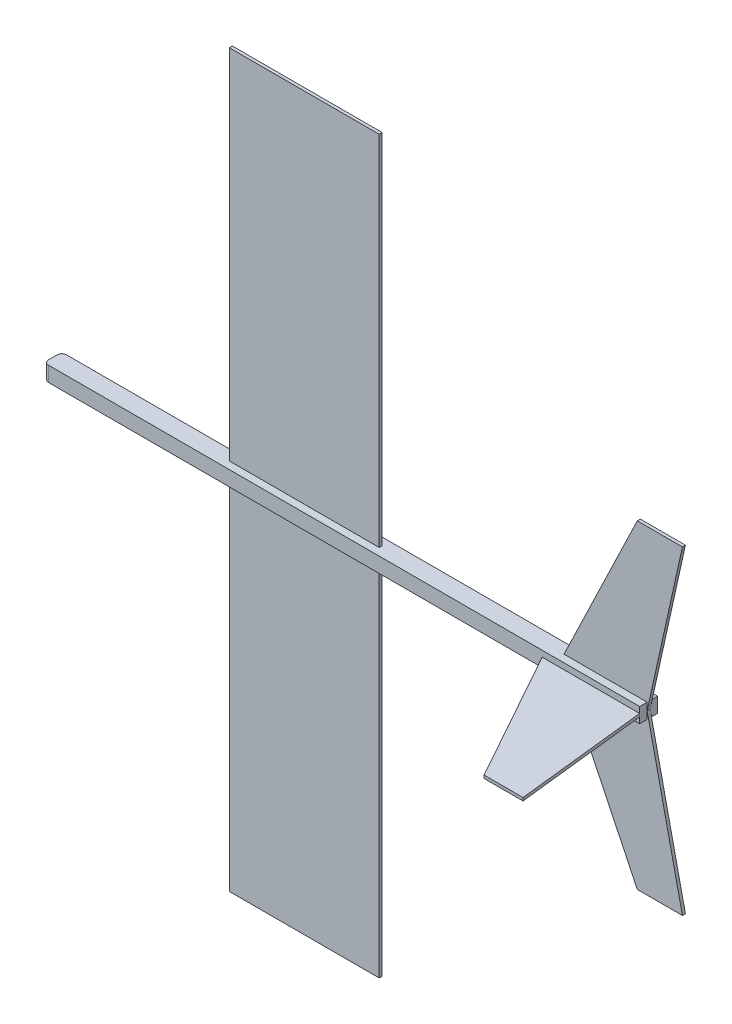
ISO-10303-21;
HEADER;
FILE_DESCRIPTION(('STEP AP214'),'2;1');
FILE_NAME('part.step','',(''),(''),'','','');
FILE_SCHEMA(('AUTOMOTIVE_DESIGN { 1 0 10303 214 1 1 1 1 }'));
ENDSEC;
DATA;
#1=APPLICATION_CONTEXT('core data for automotive mechanical design processes');
#2=APPLICATION_PROTOCOL_DEFINITION('international standard','automotive_design',2000,#1);
#3=PRODUCT_CONTEXT('',#1,'mechanical');
#4=PRODUCT('Part','Part','',(#3));
#5=PRODUCT_RELATED_PRODUCT_CATEGORY('part','',(#4));
#6=PRODUCT_DEFINITION_FORMATION('','',#4);
#7=PRODUCT_DEFINITION_CONTEXT('part definition',#1,'design');
#8=PRODUCT_DEFINITION('design','',#6,#7);
#9=PRODUCT_DEFINITION_SHAPE('','',#8);
#10=(LENGTH_UNIT() NAMED_UNIT(*) SI_UNIT(.MILLI.,.METRE.));
#11=(NAMED_UNIT(*) PLANE_ANGLE_UNIT() SI_UNIT($,.RADIAN.));
#12=(NAMED_UNIT(*) SI_UNIT($,.STERADIAN.) SOLID_ANGLE_UNIT());
#13=UNCERTAINTY_MEASURE_WITH_UNIT(LENGTH_MEASURE(1.E-05),#10,'distance_accuracy_value','');
#14=(GEOMETRIC_REPRESENTATION_CONTEXT(3) GLOBAL_UNCERTAINTY_ASSIGNED_CONTEXT((#13)) GLOBAL_UNIT_ASSIGNED_CONTEXT((#10,
#11,#12)) REPRESENTATION_CONTEXT('',''));
#15=CARTESIAN_POINT('',(0.,0.,0.));
#16=DIRECTION('',(0.,0.,1.));
#17=DIRECTION('',(1.,0.,0.));
#18=AXIS2_PLACEMENT_3D('',#15,#16,#17);
#19=CARTESIAN_POINT('',(159.,4.00000000000003,4.8));
#20=DIRECTION('',(-1.,0.,0.));
#21=DIRECTION('',(0.,0.,1.));
#22=AXIS2_PLACEMENT_3D('',#19,#20,#21);
#23=PLANE('',#22);
#24=DIRECTION('',(0.,1.,0.));
#25=VECTOR('',#24,1.);
#26=CARTESIAN_POINT('',(159.,4.00000000000003,-0.79375));
#27=LINE('',#26,#25);
#28=CARTESIAN_POINT('',(159.,-3.99999999999997,-0.79375));
#29=VERTEX_POINT('',#28);
#30=CARTESIAN_POINT('',(159.,0.,-0.79375));
#31=VERTEX_POINT('',#30);
#32=EDGE_CURVE('E424',#29,#31,#27,.T.);
#33=ORIENTED_EDGE('',*,*,#32,.F.);
#34=DIRECTION('',(0.,0.,-1.));
#35=VECTOR('',#34,1.);
#36=CARTESIAN_POINT('',(159.,-3.99999999999997,4.8));
#37=LINE('',#36,#35);
#38=CARTESIAN_POINT('',(159.,-3.99999999999997,-4.8));
#39=VERTEX_POINT('',#38);
#40=EDGE_CURVE('E388',#29,#39,#37,.T.);
#41=ORIENTED_EDGE('',*,*,#40,.T.);
#42=DIRECTION('',(0.,1.,0.));
#43=VECTOR('',#42,1.);
#44=CARTESIAN_POINT('',(159.,4.00000000000003,-4.8));
#45=LINE('',#44,#43);
#46=CARTESIAN_POINT('',(159.,4.00000000000003,-4.8));
#47=VERTEX_POINT('',#46);
#48=EDGE_CURVE('E378',#39,#47,#45,.T.);
#49=ORIENTED_EDGE('',*,*,#48,.T.);
#50=DIRECTION('',(0.,0.,-1.));
#51=VECTOR('',#50,1.);
#52=CARTESIAN_POINT('',(159.,4.00000000000003,4.8));
#53=LINE('',#52,#51);
#54=CARTESIAN_POINT('',(159.,4.00000000000003,-0.79375));
#55=VERTEX_POINT('',#54);
#56=EDGE_CURVE('E384',#55,#47,#53,.T.);
#57=ORIENTED_EDGE('',*,*,#56,.F.);
#58=DIRECTION('',(0.,1.,0.));
#59=VECTOR('',#58,1.);
#60=CARTESIAN_POINT('',(159.,4.00000000000003,-0.79375));
#61=LINE('',#60,#59);
#62=EDGE_CURVE('E416',#31,#55,#61,.T.);
#63=ORIENTED_EDGE('',*,*,#62,.F.);
#64=EDGE_LOOP('',(#33,#41,#49,#57,#63));
#65=FACE_BOUND('',#64,.T.);
#66=ADVANCED_FACE('F43',(#65),#23,.F.);
#67=CARTESIAN_POINT('',(0.,0.,4.8));
#68=DIRECTION('',(0.,0.,-1.));
#69=DIRECTION('',(-1.,0.,0.));
#70=AXIS2_PLACEMENT_3D('',#67,#68,#69);
#71=PLANE('',#70);
#72=DIRECTION('',(-1.,0.,0.));
#73=VECTOR('',#72,1.);
#74=CARTESIAN_POINT('',(159.,4.00000000000003,4.8));
#75=LINE('',#74,#73);
#76=CARTESIAN_POINT('',(159.,4.00000000000003,4.8));
#77=VERTEX_POINT('',#76);
#78=CARTESIAN_POINT('',(-156.5,4.00000000000007,4.8));
#79=VERTEX_POINT('',#78);
#80=EDGE_CURVE('E374',#77,#79,#75,.T.);
#81=ORIENTED_EDGE('',*,*,#80,.T.);
#82=DIRECTION('',(0.,-1.,0.));
#83=VECTOR('',#82,1.);
#84=CARTESIAN_POINT('',(-156.5,0.,4.8));
#85=LINE('',#84,#83);
#86=CARTESIAN_POINT('',(-156.5,-4.00000000000007,4.8));
#87=VERTEX_POINT('',#86);
#88=EDGE_CURVE('E11',#79,#87,#85,.T.);
#89=ORIENTED_EDGE('',*,*,#88,.T.);
#90=DIRECTION('',(1.,0.,0.));
#91=VECTOR('',#90,1.);
#92=CARTESIAN_POINT('',(159.,-3.99999999999997,4.8));
#93=LINE('',#92,#91);
#94=CARTESIAN_POINT('',(159.,-3.99999999999997,4.8));
#95=VERTEX_POINT('',#94);
#96=EDGE_CURVE('E367',#87,#95,#93,.T.);
#97=ORIENTED_EDGE('',*,*,#96,.T.);
#98=DIRECTION('',(0.,1.,0.));
#99=VECTOR('',#98,1.);
#100=CARTESIAN_POINT('',(159.,4.00000000000003,4.8));
#101=LINE('',#100,#99);
#102=CARTESIAN_POINT('',(159.,-0.79375,4.8));
#103=VERTEX_POINT('',#102);
#104=EDGE_CURVE('E371',#95,#103,#101,.T.);
#105=ORIENTED_EDGE('',*,*,#104,.T.);
#106=DIRECTION('',(1.,0.,0.));
#107=VECTOR('',#106,1.);
#108=CARTESIAN_POINT('',(107.,-0.79375,4.8));
#109=LINE('',#108,#107);
#110=CARTESIAN_POINT('',(107.,-0.79375,4.8));
#111=VERTEX_POINT('',#110);
#112=EDGE_CURVE('E291',#111,#103,#109,.T.);
#113=ORIENTED_EDGE('',*,*,#112,.F.);
#114=DIRECTION('',(0.,-1.,0.));
#115=VECTOR('',#114,1.);
#116=CARTESIAN_POINT('',(107.,0.79375,4.8));
#117=LINE('',#116,#115);
#118=CARTESIAN_POINT('',(107.,0.79375,4.8));
#119=VERTEX_POINT('',#118);
#120=EDGE_CURVE('E316',#119,#111,#117,.T.);
#121=ORIENTED_EDGE('',*,*,#120,.F.);
#122=DIRECTION('',(1.,0.,0.));
#123=VECTOR('',#122,1.);
#124=CARTESIAN_POINT('',(107.,0.79375,4.8));
#125=LINE('',#124,#123);
#126=CARTESIAN_POINT('',(159.,0.79375,4.8));
#127=VERTEX_POINT('',#126);
#128=EDGE_CURVE('E292',#119,#127,#125,.T.);
#129=ORIENTED_EDGE('',*,*,#128,.T.);
#130=EDGE_CURVE('E369',#127,#77,#101,.T.);
#131=ORIENTED_EDGE('',*,*,#130,.T.);
#132=EDGE_LOOP('',(#81,#89,#97,#105,#113,#121,#129,#131));
#133=FACE_BOUND('',#132,.T.);
#134=ADVANCED_FACE('F503',(#133),#71,.F.);
#135=CARTESIAN_POINT('',(159.,-3.99999999999997,4.8));
#136=DIRECTION('',(0.,1.,0.));
#137=DIRECTION('',(-1.,0.,0.));
#138=AXIS2_PLACEMENT_3D('',#135,#136,#137);
#139=PLANE('',#138);
#140=DIRECTION('',(0.,0.,-1.));
#141=VECTOR('',#140,1.);
#142=CARTESIAN_POINT('',(-159.,-4.00000000000007,4.8));
#143=LINE('',#142,#141);
#144=CARTESIAN_POINT('',(-159.,-4.00000000000007,2.3));
#145=VERTEX_POINT('',#144);
#146=CARTESIAN_POINT('',(-159.,-4.00000000000007,-2.3));
#147=VERTEX_POINT('',#146);
#148=EDGE_CURVE('E392',#145,#147,#143,.T.);
#149=ORIENTED_EDGE('',*,*,#148,.T.);
#150=CARTESIAN_POINT('',(-156.5,-4.00000000000007,-2.3));
#151=DIRECTION('',(0.,1.,0.));
#152=DIRECTION('',(-1.,0.,0.));
#153=AXIS2_PLACEMENT_3D('',#150,#151,#152);
#154=CIRCLE('',#153,2.5);
#155=CARTESIAN_POINT('',(-156.5,-4.00000000000007,-4.8));
#156=VERTEX_POINT('',#155);
#157=EDGE_CURVE('E439',#147,#156,#154,.F.);
#158=ORIENTED_EDGE('',*,*,#157,.T.);
#159=DIRECTION('',(1.,0.,0.));
#160=VECTOR('',#159,1.);
#161=CARTESIAN_POINT('',(159.,-3.99999999999997,-4.8));
#162=LINE('',#161,#160);
#163=EDGE_CURVE('E365',#156,#39,#162,.T.);
#164=ORIENTED_EDGE('',*,*,#163,.T.);
#165=ORIENTED_EDGE('',*,*,#40,.F.);
#166=DIRECTION('',(1.,0.,0.));
#167=VECTOR('',#166,1.);
#168=CARTESIAN_POINT('',(159.,-3.99999999999997,-0.79375));
#169=LINE('',#168,#167);
#170=CARTESIAN_POINT('',(114.627650142541,-3.99999999999999,-0.79375));
#171=VERTEX_POINT('',#170);
#172=EDGE_CURVE('E237',#171,#29,#169,.T.);
#173=ORIENTED_EDGE('',*,*,#172,.F.);
#174=DIRECTION('',(0.,0.,1.));
#175=VECTOR('',#174,1.);
#176=CARTESIAN_POINT('',(114.627650142541,-3.99999999999998,4.8));
#177=LINE('',#176,#175);
#178=CARTESIAN_POINT('',(114.627650142541,-3.99999999999999,0.79375));
#179=VERTEX_POINT('',#178);
#180=EDGE_CURVE('E430',#171,#179,#177,.T.);
#181=ORIENTED_EDGE('',*,*,#180,.T.);
#182=DIRECTION('',(1.,0.,0.));
#183=VECTOR('',#182,1.);
#184=CARTESIAN_POINT('',(159.,-3.99999999999997,0.79375));
#185=LINE('',#184,#183);
#186=CARTESIAN_POINT('',(159.,-3.99999999999997,0.79375));
#187=VERTEX_POINT('',#186);
#188=EDGE_CURVE('E247',#179,#187,#185,.T.);
#189=ORIENTED_EDGE('',*,*,#188,.T.);
#190=EDGE_CURVE('E389',#95,#187,#37,.T.);
#191=ORIENTED_EDGE('',*,*,#190,.F.);
#192=ORIENTED_EDGE('',*,*,#96,.F.);
#193=CARTESIAN_POINT('',(-156.5,-4.00000000000007,2.3));
#194=DIRECTION('',(0.,1.,0.));
#195=DIRECTION('',(-1.,0.,0.));
#196=AXIS2_PLACEMENT_3D('',#193,#194,#195);
#197=CIRCLE('',#196,2.5);
#198=EDGE_CURVE('E437',#87,#145,#197,.F.);
#199=ORIENTED_EDGE('',*,*,#198,.T.);
#200=EDGE_LOOP('',(#149,#158,#164,#165,#173,#181,#189,#191,#192,#199));
#201=FACE_BOUND('',#200,.T.);
#202=DIRECTION('',(-1.,0.,0.));
#203=VECTOR('',#202,1.);
#204=CARTESIAN_POINT('',(159.,-3.99999999999997,0.79375));
#205=LINE('',#204,#203);
#206=CARTESIAN_POINT('',(16.0000000000001,-4.00000000000003,0.79375));
#207=VERTEX_POINT('',#206);
#208=CARTESIAN_POINT('',(-63.9999999999999,-4.00000000000003,0.79375));
#209=VERTEX_POINT('',#208);
#210=EDGE_CURVE('E414',#207,#209,#205,.T.);
#211=ORIENTED_EDGE('',*,*,#210,.F.);
#212=DIRECTION('',(0.,0.,1.));
#213=VECTOR('',#212,1.);
#214=CARTESIAN_POINT('',(16.0000000000001,-4.00000000000002,4.8));
#215=LINE('',#214,#213);
#216=CARTESIAN_POINT('',(16.0000000000001,-4.00000000000003,-0.79375));
#217=VERTEX_POINT('',#216);
#218=EDGE_CURVE('E412',#217,#207,#215,.T.);
#219=ORIENTED_EDGE('',*,*,#218,.F.);
#220=DIRECTION('',(-1.,0.,0.));
#221=VECTOR('',#220,1.);
#222=CARTESIAN_POINT('',(159.,-3.99999999999997,-0.79375));
#223=LINE('',#222,#221);
#224=CARTESIAN_POINT('',(-63.9999999999999,-4.00000000000004,-0.79375));
#225=VERTEX_POINT('',#224);
#226=EDGE_CURVE('E406',#217,#225,#223,.T.);
#227=ORIENTED_EDGE('',*,*,#226,.T.);
#228=DIRECTION('',(0.,0.,-1.));
#229=VECTOR('',#228,1.);
#230=CARTESIAN_POINT('',(-63.9999999999999,-4.00000000000004,4.8));
#231=LINE('',#230,#229);
#232=EDGE_CURVE('E409',#209,#225,#231,.T.);
#233=ORIENTED_EDGE('',*,*,#232,.F.);
#234=EDGE_LOOP('',(#211,#219,#227,#233));
#235=FACE_BOUND('',#234,.T.);
#236=ADVANCED_FACE('F453',(#201,#235),#139,.F.);
#237=CARTESIAN_POINT('',(159.,4.00000000000003,4.8));
#238=DIRECTION('',(0.,-1.,0.));
#239=DIRECTION('',(1.,0.,0.));
#240=AXIS2_PLACEMENT_3D('',#237,#238,#239);
#241=PLANE('',#240);
#242=DIRECTION('',(-1.,0.,0.));
#243=VECTOR('',#242,1.);
#244=CARTESIAN_POINT('',(159.,4.00000000000003,-4.8));
#245=LINE('',#244,#243);
#246=CARTESIAN_POINT('',(-156.5,4.00000000000007,-4.8));
#247=VERTEX_POINT('',#246);
#248=EDGE_CURVE('E370',#47,#247,#245,.T.);
#249=ORIENTED_EDGE('',*,*,#248,.T.);
#250=CARTESIAN_POINT('',(-156.5,4.00000000000007,-2.3));
#251=DIRECTION('',(0.,-1.,0.));
#252=DIRECTION('',(1.,0.,0.));
#253=AXIS2_PLACEMENT_3D('',#250,#251,#252);
#254=CIRCLE('',#253,2.5);
#255=CARTESIAN_POINT('',(-159.,4.00000000000007,-2.3));
#256=VERTEX_POINT('',#255);
#257=EDGE_CURVE('E51',#247,#256,#254,.F.);
#258=ORIENTED_EDGE('',*,*,#257,.T.);
#259=DIRECTION('',(0.,0.,-1.));
#260=VECTOR('',#259,1.);
#261=CARTESIAN_POINT('',(-159.,4.00000000000007,4.8));
#262=LINE('',#261,#260);
#263=CARTESIAN_POINT('',(-159.,4.00000000000007,2.3));
#264=VERTEX_POINT('',#263);
#265=EDGE_CURVE('E376',#264,#256,#262,.T.);
#266=ORIENTED_EDGE('',*,*,#265,.F.);
#267=CARTESIAN_POINT('',(-156.5,4.00000000000007,2.3));
#268=DIRECTION('',(0.,-1.,0.));
#269=DIRECTION('',(1.,0.,0.));
#270=AXIS2_PLACEMENT_3D('',#267,#268,#269);
#271=CIRCLE('',#270,2.5);
#272=EDGE_CURVE('E58',#264,#79,#271,.F.);
#273=ORIENTED_EDGE('',*,*,#272,.T.);
#274=ORIENTED_EDGE('',*,*,#80,.F.);
#275=CARTESIAN_POINT('',(159.,4.00000000000003,0.79375));
#276=VERTEX_POINT('',#275);
#277=EDGE_CURVE('E385',#77,#276,#53,.T.);
#278=ORIENTED_EDGE('',*,*,#277,.T.);
#279=DIRECTION('',(-1.,0.,0.));
#280=VECTOR('',#279,1.);
#281=CARTESIAN_POINT('',(159.,4.00000000000003,0.79375));
#282=LINE('',#281,#280);
#283=CARTESIAN_POINT('',(114.627650142541,4.00000000000003,0.79375));
#284=VERTEX_POINT('',#283);
#285=EDGE_CURVE('E289',#276,#284,#282,.T.);
#286=ORIENTED_EDGE('',*,*,#285,.T.);
#287=DIRECTION('',(0.,0.,1.));
#288=VECTOR('',#287,1.);
#289=CARTESIAN_POINT('',(114.627650142541,4.00000000000003,4.8));
#290=LINE('',#289,#288);
#291=CARTESIAN_POINT('',(114.627650142541,4.00000000000003,-0.79375));
#292=VERTEX_POINT('',#291);
#293=EDGE_CURVE('E421',#292,#284,#290,.T.);
#294=ORIENTED_EDGE('',*,*,#293,.F.);
#295=DIRECTION('',(-1.,0.,0.));
#296=VECTOR('',#295,1.);
#297=CARTESIAN_POINT('',(159.,4.00000000000003,-0.79375));
#298=LINE('',#297,#296);
#299=EDGE_CURVE('E286',#55,#292,#298,.T.);
#300=ORIENTED_EDGE('',*,*,#299,.F.);
#301=ORIENTED_EDGE('',*,*,#56,.T.);
#302=EDGE_LOOP('',(#249,#258,#266,#273,#274,#278,#286,#294,#300,#301));
#303=FACE_BOUND('',#302,.T.);
#304=DIRECTION('',(1.,0.,0.));
#305=VECTOR('',#304,1.);
#306=CARTESIAN_POINT('',(159.,4.00000000000003,0.79375));
#307=LINE('',#306,#305);
#308=CARTESIAN_POINT('',(-63.9999999999999,4.00000000000005,0.79375));
#309=VERTEX_POINT('',#308);
#310=CARTESIAN_POINT('',(16.0000000000001,4.00000000000006,0.79375));
#311=VERTEX_POINT('',#310);
#312=EDGE_CURVE('E404',#309,#311,#307,.T.);
#313=ORIENTED_EDGE('',*,*,#312,.F.);
#314=DIRECTION('',(0.,0.,-1.));
#315=VECTOR('',#314,1.);
#316=CARTESIAN_POINT('',(-63.9999999999999,4.00000000000006,4.8));
#317=LINE('',#316,#315);
#318=CARTESIAN_POINT('',(-63.9999999999999,4.00000000000005,-0.79375));
#319=VERTEX_POINT('',#318);
#320=EDGE_CURVE('E401',#309,#319,#317,.T.);
#321=ORIENTED_EDGE('',*,*,#320,.T.);
#322=DIRECTION('',(1.,0.,0.));
#323=VECTOR('',#322,1.);
#324=CARTESIAN_POINT('',(159.,4.00000000000003,-0.79375));
#325=LINE('',#324,#323);
#326=CARTESIAN_POINT('',(16.0000000000008,4.00000000000005,-0.79375));
#327=VERTEX_POINT('',#326);
#328=EDGE_CURVE('E395',#319,#327,#325,.T.);
#329=ORIENTED_EDGE('',*,*,#328,.T.);
#330=DIRECTION('',(0.,0.,1.));
#331=VECTOR('',#330,1.);
#332=CARTESIAN_POINT('',(16.0000000000001,4.00000000000005,4.8));
#333=LINE('',#332,#331);
#334=EDGE_CURVE('E398',#327,#311,#333,.T.);
#335=ORIENTED_EDGE('',*,*,#334,.T.);
#336=EDGE_LOOP('',(#313,#321,#329,#335));
#337=FACE_BOUND('',#336,.T.);
#338=ADVANCED_FACE('F443',(#303,#337),#241,.F.);
#339=CARTESIAN_POINT('',(-159.,4.00000000000007,4.8));
#340=DIRECTION('',(1.,0.,0.));
#341=DIRECTION('',(0.,0.,-1.));
#342=AXIS2_PLACEMENT_3D('',#339,#340,#341);
#343=PLANE('',#342);
#344=ORIENTED_EDGE('',*,*,#265,.T.);
#345=DIRECTION('',(0.,-1.,0.));
#346=VECTOR('',#345,1.);
#347=CARTESIAN_POINT('',(-159.,-4.00000000000007,-2.3));
#348=LINE('',#347,#346);
#349=EDGE_CURVE('E434',#256,#147,#348,.T.);
#350=ORIENTED_EDGE('',*,*,#349,.T.);
#351=ORIENTED_EDGE('',*,*,#148,.F.);
#352=DIRECTION('',(0.,-1.,0.));
#353=VECTOR('',#352,1.);
#354=CARTESIAN_POINT('',(-159.,4.00000000000007,2.3));
#355=LINE('',#354,#353);
#356=EDGE_CURVE('E432',#145,#264,#355,.F.);
#357=ORIENTED_EDGE('',*,*,#356,.T.);
#358=EDGE_LOOP('',(#344,#350,#351,#357));
#359=FACE_BOUND('',#358,.T.);
#360=ADVANCED_FACE('F448',(#359),#343,.F.);
#361=ORIENTED_EDGE('',*,*,#190,.T.);
#362=DIRECTION('',(0.,1.,0.));
#363=VECTOR('',#362,1.);
#364=CARTESIAN_POINT('',(159.,4.00000000000003,0.79375));
#365=LINE('',#364,#363);
#366=CARTESIAN_POINT('',(159.,0.,0.79375));
#367=VERTEX_POINT('',#366);
#368=EDGE_CURVE('E427',#187,#367,#365,.T.);
#369=ORIENTED_EDGE('',*,*,#368,.T.);
#370=DIRECTION('',(0.,1.,0.));
#371=VECTOR('',#370,1.);
#372=CARTESIAN_POINT('',(159.,4.00000000000003,0.79375));
#373=LINE('',#372,#371);
#374=EDGE_CURVE('E419',#367,#276,#373,.T.);
#375=ORIENTED_EDGE('',*,*,#374,.T.);
#376=ORIENTED_EDGE('',*,*,#277,.F.);
#377=ORIENTED_EDGE('',*,*,#130,.F.);
#378=DIRECTION('',(0.,-1.,0.));
#379=VECTOR('',#378,1.);
#380=CARTESIAN_POINT('',(159.,0.79375,4.8));
#381=LINE('',#380,#379);
#382=EDGE_CURVE('E305',#127,#103,#381,.T.);
#383=ORIENTED_EDGE('',*,*,#382,.T.);
#384=ORIENTED_EDGE('',*,*,#104,.F.);
#385=EDGE_LOOP('',(#361,#369,#375,#376,#377,#383,#384));
#386=FACE_BOUND('',#385,.T.);
#387=ADVANCED_FACE('F470',(#386),#23,.F.);
#388=CARTESIAN_POINT('',(0.,0.,-4.8));
#389=DIRECTION('',(0.,0.,-1.));
#390=DIRECTION('',(-1.,0.,0.));
#391=AXIS2_PLACEMENT_3D('',#388,#389,#390);
#392=PLANE('',#391);
#393=ORIENTED_EDGE('',*,*,#163,.F.);
#394=DIRECTION('',(0.,-1.,0.));
#395=VECTOR('',#394,1.);
#396=CARTESIAN_POINT('',(-156.5,4.00000000000007,-4.8));
#397=LINE('',#396,#395);
#398=EDGE_CURVE('E66',#156,#247,#397,.F.);
#399=ORIENTED_EDGE('',*,*,#398,.T.);
#400=ORIENTED_EDGE('',*,*,#248,.F.);
#401=ORIENTED_EDGE('',*,*,#48,.F.);
#402=EDGE_LOOP('',(#393,#399,#400,#401));
#403=FACE_BOUND('',#402,.T.);
#404=ADVANCED_FACE('F458',(#403),#392,.T.);
#405=CARTESIAN_POINT('',(-63.9999999999999,0.,0.79375));
#406=DIRECTION('',(-1.,0.,0.));
#407=DIRECTION('',(0.,-1.,0.));
#408=AXIS2_PLACEMENT_3D('',#405,#406,#407);
#409=PLANE('',#408);
#410=ORIENTED_EDGE('',*,*,#320,.F.);
#411=DIRECTION('',(0.,1.,0.));
#412=VECTOR('',#411,1.);
#413=CARTESIAN_POINT('',(-63.9999999999999,0.,0.79375));
#414=LINE('',#413,#412);
#415=CARTESIAN_POINT('',(-63.9999999999992,195.,0.79375));
#416=VERTEX_POINT('',#415);
#417=EDGE_CURVE('E354',#309,#416,#414,.T.);
#418=ORIENTED_EDGE('',*,*,#417,.T.);
#419=DIRECTION('',(0.,0.,-1.));
#420=VECTOR('',#419,1.);
#421=CARTESIAN_POINT('',(-63.9999999999992,195.,0.79375));
#422=LINE('',#421,#420);
#423=CARTESIAN_POINT('',(-63.9999999999992,195.,-0.79375));
#424=VERTEX_POINT('',#423);
#425=EDGE_CURVE('E362',#416,#424,#422,.T.);
#426=ORIENTED_EDGE('',*,*,#425,.T.);
#427=DIRECTION('',(0.,1.,0.));
#428=VECTOR('',#427,1.);
#429=CARTESIAN_POINT('',(-63.9999999999999,0.,-0.79375));
#430=LINE('',#429,#428);
#431=EDGE_CURVE('E351',#319,#424,#430,.T.);
#432=ORIENTED_EDGE('',*,*,#431,.F.);
#433=EDGE_LOOP('',(#410,#418,#426,#432));
#434=FACE_BOUND('',#433,.T.);
#435=ADVANCED_FACE('F517',(#434),#409,.T.);
#436=CARTESIAN_POINT('',(16.0000000000008,195.,0.79375));
#437=DIRECTION('',(1.,0.,0.));
#438=DIRECTION('',(0.,1.,0.));
#439=AXIS2_PLACEMENT_3D('',#436,#437,#438);
#440=PLANE('',#439);
#441=ORIENTED_EDGE('',*,*,#334,.F.);
#442=DIRECTION('',(0.,-1.,0.));
#443=VECTOR('',#442,1.);
#444=CARTESIAN_POINT('',(16.0000000000008,195.,-0.79375));
#445=LINE('',#444,#443);
#446=CARTESIAN_POINT('',(16.0000000000008,195.,-0.79375));
#447=VERTEX_POINT('',#446);
#448=EDGE_CURVE('E359',#447,#327,#445,.T.);
#449=ORIENTED_EDGE('',*,*,#448,.F.);
#450=DIRECTION('',(0.,0.,-1.));
#451=VECTOR('',#450,1.);
#452=CARTESIAN_POINT('',(16.0000000000008,195.,0.79375));
#453=LINE('',#452,#451);
#454=CARTESIAN_POINT('',(16.0000000000008,195.,0.79375));
#455=VERTEX_POINT('',#454);
#456=EDGE_CURVE('E356',#455,#447,#453,.T.);
#457=ORIENTED_EDGE('',*,*,#456,.F.);
#458=DIRECTION('',(0.,-1.,0.));
#459=VECTOR('',#458,1.);
#460=CARTESIAN_POINT('',(16.0000000000008,195.,0.79375));
#461=LINE('',#460,#459);
#462=EDGE_CURVE('E350',#455,#311,#461,.T.);
#463=ORIENTED_EDGE('',*,*,#462,.T.);
#464=EDGE_LOOP('',(#441,#449,#457,#463));
#465=FACE_BOUND('',#464,.T.);
#466=ADVANCED_FACE('F592',(#465),#440,.T.);
#467=CARTESIAN_POINT('',(0.,0.,0.79375));
#468=DIRECTION('',(0.,0.,-1.));
#469=DIRECTION('',(-1.,0.,0.));
#470=AXIS2_PLACEMENT_3D('',#467,#468,#469);
#471=PLANE('',#470);
#472=ORIENTED_EDGE('',*,*,#417,.F.);
#473=ORIENTED_EDGE('',*,*,#312,.T.);
#474=ORIENTED_EDGE('',*,*,#462,.F.);
#475=DIRECTION('',(1.,0.,0.));
#476=VECTOR('',#475,1.);
#477=CARTESIAN_POINT('',(-63.9999999999992,195.,0.79375));
#478=LINE('',#477,#476);
#479=EDGE_CURVE('E347',#416,#455,#478,.T.);
#480=ORIENTED_EDGE('',*,*,#479,.F.);
#481=EDGE_LOOP('',(#472,#473,#474,#480));
#482=FACE_BOUND('',#481,.T.);
#483=ADVANCED_FACE('F588',(#482),#471,.F.);
#484=CARTESIAN_POINT('',(0.,0.,-0.79375));
#485=DIRECTION('',(0.,0.,-1.));
#486=DIRECTION('',(-1.,0.,0.));
#487=AXIS2_PLACEMENT_3D('',#484,#485,#486);
#488=PLANE('',#487);
#489=ORIENTED_EDGE('',*,*,#328,.F.);
#490=ORIENTED_EDGE('',*,*,#431,.T.);
#491=DIRECTION('',(1.,0.,0.));
#492=VECTOR('',#491,1.);
#493=CARTESIAN_POINT('',(-63.9999999999992,195.,-0.79375));
#494=LINE('',#493,#492);
#495=EDGE_CURVE('E344',#424,#447,#494,.T.);
#496=ORIENTED_EDGE('',*,*,#495,.T.);
#497=ORIENTED_EDGE('',*,*,#448,.T.);
#498=EDGE_LOOP('',(#489,#490,#496,#497));
#499=FACE_BOUND('',#498,.T.);
#500=ADVANCED_FACE('F591',(#499),#488,.T.);
#501=CARTESIAN_POINT('',(-63.9999999999992,195.,0.79375));
#502=DIRECTION('',(0.,1.,0.));
#503=DIRECTION('',(-1.,0.,0.));
#504=AXIS2_PLACEMENT_3D('',#501,#502,#503);
#505=PLANE('',#504);
#506=ORIENTED_EDGE('',*,*,#495,.F.);
#507=ORIENTED_EDGE('',*,*,#425,.F.);
#508=ORIENTED_EDGE('',*,*,#479,.T.);
#509=ORIENTED_EDGE('',*,*,#456,.T.);
#510=EDGE_LOOP('',(#506,#507,#508,#509));
#511=FACE_BOUND('',#510,.T.);
#512=ADVANCED_FACE('F580',(#511),#505,.T.);
#513=CARTESIAN_POINT('',(16.0000000000008,-195.,0.79375));
#514=DIRECTION('',(-1.,0.,0.));
#515=DIRECTION('',(0.,-1.,0.));
#516=AXIS2_PLACEMENT_3D('',#513,#514,#515);
#517=PLANE('',#516);
#518=DIRECTION('',(0.,1.,0.));
#519=VECTOR('',#518,1.);
#520=CARTESIAN_POINT('',(16.0000000000008,-195.,-0.79375));
#521=LINE('',#520,#519);
#522=CARTESIAN_POINT('',(16.0000000000008,-195.,-0.79375));
#523=VERTEX_POINT('',#522);
#524=EDGE_CURVE('E329',#523,#217,#521,.T.);
#525=ORIENTED_EDGE('',*,*,#524,.T.);
#526=ORIENTED_EDGE('',*,*,#218,.T.);
#527=DIRECTION('',(0.,1.,0.));
#528=VECTOR('',#527,1.);
#529=CARTESIAN_POINT('',(16.0000000000008,-195.,0.79375));
#530=LINE('',#529,#528);
#531=CARTESIAN_POINT('',(16.0000000000008,-195.,0.79375));
#532=VERTEX_POINT('',#531);
#533=EDGE_CURVE('E331',#532,#207,#530,.T.);
#534=ORIENTED_EDGE('',*,*,#533,.F.);
#535=DIRECTION('',(0.,0.,-1.));
#536=VECTOR('',#535,1.);
#537=CARTESIAN_POINT('',(16.0000000000008,-195.,0.79375));
#538=LINE('',#537,#536);
#539=EDGE_CURVE('E341',#532,#523,#538,.T.);
#540=ORIENTED_EDGE('',*,*,#539,.T.);
#541=EDGE_LOOP('',(#525,#526,#534,#540));
#542=FACE_BOUND('',#541,.T.);
#543=ADVANCED_FACE('F577',(#542),#517,.F.);
#544=CARTESIAN_POINT('',(-63.9999999999999,0.,0.79375));
#545=DIRECTION('',(1.,0.,0.));
#546=DIRECTION('',(0.,1.,0.));
#547=AXIS2_PLACEMENT_3D('',#544,#545,#546);
#548=PLANE('',#547);
#549=DIRECTION('',(0.,-1.,0.));
#550=VECTOR('',#549,1.);
#551=CARTESIAN_POINT('',(-63.9999999999999,0.,0.79375));
#552=LINE('',#551,#550);
#553=CARTESIAN_POINT('',(-63.9999999999992,-195.,0.79375));
#554=VERTEX_POINT('',#553);
#555=EDGE_CURVE('E328',#209,#554,#552,.T.);
#556=ORIENTED_EDGE('',*,*,#555,.F.);
#557=ORIENTED_EDGE('',*,*,#232,.T.);
#558=DIRECTION('',(0.,-1.,0.));
#559=VECTOR('',#558,1.);
#560=CARTESIAN_POINT('',(-63.9999999999999,0.,-0.79375));
#561=LINE('',#560,#559);
#562=CARTESIAN_POINT('',(-63.9999999999992,-195.,-0.79375));
#563=VERTEX_POINT('',#562);
#564=EDGE_CURVE('E337',#225,#563,#561,.T.);
#565=ORIENTED_EDGE('',*,*,#564,.T.);
#566=DIRECTION('',(0.,0.,-1.));
#567=VECTOR('',#566,1.);
#568=CARTESIAN_POINT('',(-63.9999999999992,-195.,0.79375));
#569=LINE('',#568,#567);
#570=EDGE_CURVE('E334',#554,#563,#569,.T.);
#571=ORIENTED_EDGE('',*,*,#570,.F.);
#572=EDGE_LOOP('',(#556,#557,#565,#571));
#573=FACE_BOUND('',#572,.T.);
#574=ADVANCED_FACE('F572',(#573),#548,.F.);
#575=CARTESIAN_POINT('',(0.,0.,0.79375));
#576=DIRECTION('',(0.,0.,-1.));
#577=DIRECTION('',(-1.,0.,0.));
#578=AXIS2_PLACEMENT_3D('',#575,#576,#577);
#579=PLANE('',#578);
#580=ORIENTED_EDGE('',*,*,#533,.T.);
#581=ORIENTED_EDGE('',*,*,#210,.T.);
#582=ORIENTED_EDGE('',*,*,#555,.T.);
#583=DIRECTION('',(1.,0.,0.));
#584=VECTOR('',#583,1.);
#585=CARTESIAN_POINT('',(-63.9999999999992,-195.,0.79375));
#586=LINE('',#585,#584);
#587=EDGE_CURVE('E325',#554,#532,#586,.T.);
#588=ORIENTED_EDGE('',*,*,#587,.T.);
#589=EDGE_LOOP('',(#580,#581,#582,#588));
#590=FACE_BOUND('',#589,.T.);
#591=ADVANCED_FACE('F568',(#590),#579,.F.);
#592=CARTESIAN_POINT('',(0.,0.,-0.79375));
#593=DIRECTION('',(0.,0.,-1.));
#594=DIRECTION('',(-1.,0.,0.));
#595=AXIS2_PLACEMENT_3D('',#592,#593,#594);
#596=PLANE('',#595);
#597=ORIENTED_EDGE('',*,*,#226,.F.);
#598=ORIENTED_EDGE('',*,*,#524,.F.);
#599=DIRECTION('',(1.,0.,0.));
#600=VECTOR('',#599,1.);
#601=CARTESIAN_POINT('',(-63.9999999999992,-195.,-0.79375));
#602=LINE('',#601,#600);
#603=EDGE_CURVE('E318',#563,#523,#602,.T.);
#604=ORIENTED_EDGE('',*,*,#603,.F.);
#605=ORIENTED_EDGE('',*,*,#564,.F.);
#606=EDGE_LOOP('',(#597,#598,#604,#605));
#607=FACE_BOUND('',#606,.T.);
#608=ADVANCED_FACE('F571',(#607),#596,.T.);
#609=CARTESIAN_POINT('',(-63.9999999999992,-195.,0.79375));
#610=DIRECTION('',(0.,1.,0.));
#611=DIRECTION('',(-1.,0.,0.));
#612=AXIS2_PLACEMENT_3D('',#609,#610,#611);
#613=PLANE('',#612);
#614=ORIENTED_EDGE('',*,*,#603,.T.);
#615=ORIENTED_EDGE('',*,*,#539,.F.);
#616=ORIENTED_EDGE('',*,*,#587,.F.);
#617=ORIENTED_EDGE('',*,*,#570,.T.);
#618=EDGE_LOOP('',(#614,#615,#616,#617));
#619=FACE_BOUND('',#618,.T.);
#620=ADVANCED_FACE('F560',(#619),#613,.F.);
#621=CARTESIAN_POINT('',(145.966007971597,0.79375,74.8));
#622=DIRECTION('',(-0.873748311640368,0.,0.486378338236404));
#623=DIRECTION('',(0.486378338236404,0.,0.873748311640368));
#624=AXIS2_PLACEMENT_3D('',#621,#622,#623);
#625=PLANE('',#624);
#626=DIRECTION('',(-0.486378338236404,0.,-0.873748311640368));
#627=VECTOR('',#626,1.);
#628=CARTESIAN_POINT('',(145.966007971597,-0.79375,74.8));
#629=LINE('',#628,#627);
#630=CARTESIAN_POINT('',(145.966007971597,-0.79375,74.8));
#631=VERTEX_POINT('',#630);
#632=EDGE_CURVE('E296',#631,#111,#629,.T.);
#633=ORIENTED_EDGE('',*,*,#632,.F.);
#634=DIRECTION('',(0.,-1.,0.));
#635=VECTOR('',#634,1.);
#636=CARTESIAN_POINT('',(145.966007971597,0.79375,74.8));
#637=LINE('',#636,#635);
#638=CARTESIAN_POINT('',(145.966007971597,0.79375,74.8));
#639=VERTEX_POINT('',#638);
#640=EDGE_CURVE('E319',#639,#631,#637,.T.);
#641=ORIENTED_EDGE('',*,*,#640,.F.);
#642=DIRECTION('',(-0.486378338236404,0.,-0.873748311640368));
#643=VECTOR('',#642,1.);
#644=CARTESIAN_POINT('',(145.966007971597,0.79375,74.8));
#645=LINE('',#644,#643);
#646=EDGE_CURVE('E302',#639,#119,#645,.T.);
#647=ORIENTED_EDGE('',*,*,#646,.T.);
#648=ORIENTED_EDGE('',*,*,#120,.T.);
#649=EDGE_LOOP('',(#633,#641,#647,#648));
#650=FACE_BOUND('',#649,.T.);
#651=ADVANCED_FACE('F556',(#650),#625,.T.);
#652=CARTESIAN_POINT('',(166.766007971597,0.79375,74.8));
#653=DIRECTION('',(0.,0.,1.));
#654=DIRECTION('',(1.,0.,0.));
#655=AXIS2_PLACEMENT_3D('',#652,#653,#654);
#656=PLANE('',#655);
#657=DIRECTION('',(-1.,0.,0.));
#658=VECTOR('',#657,1.);
#659=CARTESIAN_POINT('',(166.766007971597,-0.79375,74.8));
#660=LINE('',#659,#658);
#661=CARTESIAN_POINT('',(166.766007971597,-0.79375,74.8));
#662=VERTEX_POINT('',#661);
#663=EDGE_CURVE('E311',#662,#631,#660,.T.);
#664=ORIENTED_EDGE('',*,*,#663,.F.);
#665=DIRECTION('',(0.,-1.,0.));
#666=VECTOR('',#665,1.);
#667=CARTESIAN_POINT('',(166.766007971597,0.79375,74.8));
#668=LINE('',#667,#666);
#669=CARTESIAN_POINT('',(166.766007971597,0.79375,74.8));
#670=VERTEX_POINT('',#669);
#671=EDGE_CURVE('E321',#670,#662,#668,.T.);
#672=ORIENTED_EDGE('',*,*,#671,.F.);
#673=DIRECTION('',(-1.,0.,0.));
#674=VECTOR('',#673,1.);
#675=CARTESIAN_POINT('',(166.766007971597,0.79375,74.8));
#676=LINE('',#675,#674);
#677=EDGE_CURVE('E299',#670,#639,#676,.T.);
#678=ORIENTED_EDGE('',*,*,#677,.T.);
#679=ORIENTED_EDGE('',*,*,#640,.T.);
#680=EDGE_LOOP('',(#664,#672,#678,#679));
#681=FACE_BOUND('',#680,.T.);
#682=ADVANCED_FACE('F559',(#681),#656,.T.);
#683=CARTESIAN_POINT('',(159.,0.79375,4.8));
#684=DIRECTION('',(0.99390206283076,0.,-0.110266447756153));
#685=DIRECTION('',(-0.110266447756153,0.,-0.99390206283076));
#686=AXIS2_PLACEMENT_3D('',#683,#684,#685);
#687=PLANE('',#686);
#688=DIRECTION('',(0.110266447756153,0.,0.99390206283076));
#689=VECTOR('',#688,1.);
#690=CARTESIAN_POINT('',(159.,-0.79375,4.8));
#691=LINE('',#690,#689);
#692=EDGE_CURVE('E308',#103,#662,#691,.T.);
#693=ORIENTED_EDGE('',*,*,#692,.F.);
#694=ORIENTED_EDGE('',*,*,#382,.F.);
#695=DIRECTION('',(0.110266447756153,0.,0.99390206283076));
#696=VECTOR('',#695,1.);
#697=CARTESIAN_POINT('',(159.,0.79375,4.8));
#698=LINE('',#697,#696);
#699=EDGE_CURVE('E295',#127,#670,#698,.T.);
#700=ORIENTED_EDGE('',*,*,#699,.T.);
#701=ORIENTED_EDGE('',*,*,#671,.T.);
#702=EDGE_LOOP('',(#693,#694,#700,#701));
#703=FACE_BOUND('',#702,.T.);
#704=ADVANCED_FACE('F551',(#703),#687,.T.);
#705=CARTESIAN_POINT('',(0.,0.79375,0.));
#706=DIRECTION('',(0.,-1.,0.));
#707=DIRECTION('',(0.,0.,-1.));
#708=AXIS2_PLACEMENT_3D('',#705,#706,#707);
#709=PLANE('',#708);
#710=ORIENTED_EDGE('',*,*,#128,.F.);
#711=ORIENTED_EDGE('',*,*,#646,.F.);
#712=ORIENTED_EDGE('',*,*,#677,.F.);
#713=ORIENTED_EDGE('',*,*,#699,.F.);
#714=EDGE_LOOP('',(#710,#711,#712,#713));
#715=FACE_BOUND('',#714,.T.);
#716=ADVANCED_FACE('F547',(#715),#709,.F.);
#717=CARTESIAN_POINT('',(0.,-0.79375,0.));
#718=DIRECTION('',(0.,-1.,0.));
#719=DIRECTION('',(0.,0.,-1.));
#720=AXIS2_PLACEMENT_3D('',#717,#718,#719);
#721=PLANE('',#720);
#722=ORIENTED_EDGE('',*,*,#112,.T.);
#723=ORIENTED_EDGE('',*,*,#692,.T.);
#724=ORIENTED_EDGE('',*,*,#663,.T.);
#725=ORIENTED_EDGE('',*,*,#632,.T.);
#726=EDGE_LOOP('',(#722,#723,#724,#725));
#727=FACE_BOUND('',#726,.T.);
#728=ADVANCED_FACE('F550',(#727),#721,.T.);
#729=CARTESIAN_POINT('',(153.758948036131,85.2,0.79375));
#730=DIRECTION('',(0.90084983444906,-0.434130827946026,0.));
#731=DIRECTION('',(0.434130827946026,0.90084983444906,0.));
#732=AXIS2_PLACEMENT_3D('',#729,#730,#731);
#733=PLANE('',#732);
#734=DIRECTION('',(-0.434130827946026,-0.90084983444906,0.));
#735=VECTOR('',#734,1.);
#736=CARTESIAN_POINT('',(153.758948036131,85.2,-0.79375));
#737=LINE('',#736,#735);
#738=CARTESIAN_POINT('',(153.758948036131,85.2,-0.79375));
#739=VERTEX_POINT('',#738);
#740=EDGE_CURVE('E267',#739,#292,#737,.T.);
#741=ORIENTED_EDGE('',*,*,#740,.T.);
#742=ORIENTED_EDGE('',*,*,#293,.T.);
#743=DIRECTION('',(-0.434130827946026,-0.90084983444906,0.));
#744=VECTOR('',#743,1.);
#745=CARTESIAN_POINT('',(153.758948036131,85.2,0.79375));
#746=LINE('',#745,#744);
#747=CARTESIAN_POINT('',(153.758948036131,85.2,0.79375));
#748=VERTEX_POINT('',#747);
#749=EDGE_CURVE('E269',#748,#284,#746,.T.);
#750=ORIENTED_EDGE('',*,*,#749,.F.);
#751=DIRECTION('',(0.,0.,-1.));
#752=VECTOR('',#751,1.);
#753=CARTESIAN_POINT('',(153.758948036131,85.2,0.79375));
#754=LINE('',#753,#752);
#755=EDGE_CURVE('E272',#748,#739,#754,.T.);
#756=ORIENTED_EDGE('',*,*,#755,.T.);
#757=EDGE_LOOP('',(#741,#742,#750,#756));
#758=FACE_BOUND('',#757,.T.);
#759=ADVANCED_FACE('F489',(#758),#733,.F.);
#760=CARTESIAN_POINT('',(0.,0.,0.79375));
#761=DIRECTION('',(0.,0.,1.));
#762=DIRECTION('',(1.,0.,0.));
#763=AXIS2_PLACEMENT_3D('',#760,#761,#762);
#764=PLANE('',#763);
#765=ORIENTED_EDGE('',*,*,#285,.F.);
#766=ORIENTED_EDGE('',*,*,#374,.F.);
#767=DIRECTION('',(0.215855852939906,0.976425240738678,0.));
#768=VECTOR('',#767,1.);
#769=CARTESIAN_POINT('',(159.,0.,0.79375));
#770=LINE('',#769,#768);
#771=CARTESIAN_POINT('',(177.834948036131,85.2,0.79375));
#772=VERTEX_POINT('',#771);
#773=EDGE_CURVE('E264',#367,#772,#770,.T.);
#774=ORIENTED_EDGE('',*,*,#773,.T.);
#775=DIRECTION('',(-1.,0.,0.));
#776=VECTOR('',#775,1.);
#777=CARTESIAN_POINT('',(177.834948036131,85.2,0.79375));
#778=LINE('',#777,#776);
#779=EDGE_CURVE('E266',#772,#748,#778,.T.);
#780=ORIENTED_EDGE('',*,*,#779,.T.);
#781=ORIENTED_EDGE('',*,*,#749,.T.);
#782=EDGE_LOOP('',(#765,#766,#774,#780,#781));
#783=FACE_BOUND('',#782,.T.);
#784=ADVANCED_FACE('F477',(#783),#764,.T.);
#785=CARTESIAN_POINT('',(0.,0.,-0.79375));
#786=DIRECTION('',(0.,0.,1.));
#787=DIRECTION('',(1.,0.,0.));
#788=AXIS2_PLACEMENT_3D('',#785,#786,#787);
#789=PLANE('',#788);
#790=ORIENTED_EDGE('',*,*,#62,.T.);
#791=ORIENTED_EDGE('',*,*,#299,.T.);
#792=ORIENTED_EDGE('',*,*,#740,.F.);
#793=DIRECTION('',(-1.,0.,0.));
#794=VECTOR('',#793,1.);
#795=CARTESIAN_POINT('',(177.834948036131,85.2,-0.79375));
#796=LINE('',#795,#794);
#797=CARTESIAN_POINT('',(177.834948036131,85.2,-0.79375));
#798=VERTEX_POINT('',#797);
#799=EDGE_CURVE('E274',#798,#739,#796,.T.);
#800=ORIENTED_EDGE('',*,*,#799,.F.);
#801=DIRECTION('',(0.215855852939906,0.976425240738678,0.));
#802=VECTOR('',#801,1.);
#803=CARTESIAN_POINT('',(159.,0.,-0.79375));
#804=LINE('',#803,#802);
#805=EDGE_CURVE('E263',#31,#798,#804,.T.);
#806=ORIENTED_EDGE('',*,*,#805,.F.);
#807=EDGE_LOOP('',(#790,#791,#792,#800,#806));
#808=FACE_BOUND('',#807,.T.);
#809=ADVANCED_FACE('F492',(#808),#789,.F.);
#810=CARTESIAN_POINT('',(159.,0.,0.79375));
#811=DIRECTION('',(-0.976425240738678,0.215855852939906,0.));
#812=DIRECTION('',(-0.215855852939906,-0.976425240738678,0.));
#813=AXIS2_PLACEMENT_3D('',#810,#811,#812);
#814=PLANE('',#813);
#815=ORIENTED_EDGE('',*,*,#805,.T.);
#816=DIRECTION('',(0.,0.,-1.));
#817=VECTOR('',#816,1.);
#818=CARTESIAN_POINT('',(177.834948036131,85.2,0.79375));
#819=LINE('',#818,#817);
#820=EDGE_CURVE('E280',#772,#798,#819,.T.);
#821=ORIENTED_EDGE('',*,*,#820,.F.);
#822=ORIENTED_EDGE('',*,*,#773,.F.);
#823=DIRECTION('',(0.,0.,-1.));
#824=VECTOR('',#823,1.);
#825=CARTESIAN_POINT('',(159.,0.,0.79375));
#826=LINE('',#825,#824);
#827=EDGE_CURVE('E283',#367,#31,#826,.T.);
#828=ORIENTED_EDGE('',*,*,#827,.T.);
#829=EDGE_LOOP('',(#815,#821,#822,#828));
#830=FACE_BOUND('',#829,.T.);
#831=ADVANCED_FACE('F480',(#830),#814,.F.);
#832=CARTESIAN_POINT('',(177.834948036131,85.2,0.79375));
#833=DIRECTION('',(0.,-1.,0.));
#834=DIRECTION('',(0.,0.,-1.));
#835=AXIS2_PLACEMENT_3D('',#832,#833,#834);
#836=PLANE('',#835);
#837=ORIENTED_EDGE('',*,*,#799,.T.);
#838=ORIENTED_EDGE('',*,*,#755,.F.);
#839=ORIENTED_EDGE('',*,*,#779,.F.);
#840=ORIENTED_EDGE('',*,*,#820,.T.);
#841=EDGE_LOOP('',(#837,#838,#839,#840));
#842=FACE_BOUND('',#841,.T.);
#843=ADVANCED_FACE('F486',(#842),#836,.F.);
#844=CARTESIAN_POINT('',(153.758948036131,-85.2,0.79375));
#845=DIRECTION('',(-0.90084983444906,-0.434130827946026,0.));
#846=DIRECTION('',(0.434130827946026,-0.90084983444906,0.));
#847=AXIS2_PLACEMENT_3D('',#844,#845,#846);
#848=PLANE('',#847);
#849=ORIENTED_EDGE('',*,*,#180,.F.);
#850=DIRECTION('',(-0.434130827946026,0.90084983444906,0.));
#851=VECTOR('',#850,1.);
#852=CARTESIAN_POINT('',(153.758948036131,-85.2,-0.79375));
#853=LINE('',#852,#851);
#854=CARTESIAN_POINT('',(153.758948036131,-85.2,-0.79375));
#855=VERTEX_POINT('',#854);
#856=EDGE_CURVE('E232',#855,#171,#853,.T.);
#857=ORIENTED_EDGE('',*,*,#856,.F.);
#858=DIRECTION('',(0.,0.,-1.));
#859=VECTOR('',#858,1.);
#860=CARTESIAN_POINT('',(153.758948036131,-85.2,0.79375));
#861=LINE('',#860,#859);
#862=CARTESIAN_POINT('',(153.758948036131,-85.2,0.79375));
#863=VERTEX_POINT('',#862);
#864=EDGE_CURVE('E226',#863,#855,#861,.T.);
#865=ORIENTED_EDGE('',*,*,#864,.F.);
#866=DIRECTION('',(-0.434130827946026,0.90084983444906,0.));
#867=VECTOR('',#866,1.);
#868=CARTESIAN_POINT('',(153.758948036131,-85.2,0.79375));
#869=LINE('',#868,#867);
#870=EDGE_CURVE('E229',#863,#179,#869,.T.);
#871=ORIENTED_EDGE('',*,*,#870,.T.);
#872=EDGE_LOOP('',(#849,#857,#865,#871));
#873=FACE_BOUND('',#872,.T.);
#874=ADVANCED_FACE('F228',(#873),#848,.T.);
#875=CARTESIAN_POINT('',(0.,0.,0.79375));
#876=DIRECTION('',(0.,0.,1.));
#877=DIRECTION('',(1.,0.,0.));
#878=AXIS2_PLACEMENT_3D('',#875,#876,#877);
#879=PLANE('',#878);
#880=ORIENTED_EDGE('',*,*,#188,.F.);
#881=ORIENTED_EDGE('',*,*,#870,.F.);
#882=DIRECTION('',(-1.,0.,0.));
#883=VECTOR('',#882,1.);
#884=CARTESIAN_POINT('',(177.834948036131,-85.2,0.79375));
#885=LINE('',#884,#883);
#886=CARTESIAN_POINT('',(177.834948036131,-85.2,0.79375));
#887=VERTEX_POINT('',#886);
#888=EDGE_CURVE('E244',#887,#863,#885,.T.);
#889=ORIENTED_EDGE('',*,*,#888,.F.);
#890=DIRECTION('',(0.215855852939906,-0.976425240738678,0.));
#891=VECTOR('',#890,1.);
#892=CARTESIAN_POINT('',(159.,0.,0.79375));
#893=LINE('',#892,#891);
#894=EDGE_CURVE('E251',#367,#887,#893,.T.);
#895=ORIENTED_EDGE('',*,*,#894,.F.);
#896=ORIENTED_EDGE('',*,*,#368,.F.);
#897=EDGE_LOOP('',(#880,#881,#889,#895,#896));
#898=FACE_BOUND('',#897,.T.);
#899=ADVANCED_FACE('F242',(#898),#879,.T.);
#900=CARTESIAN_POINT('',(0.,0.,-0.79375));
#901=DIRECTION('',(0.,0.,1.));
#902=DIRECTION('',(1.,0.,0.));
#903=AXIS2_PLACEMENT_3D('',#900,#901,#902);
#904=PLANE('',#903);
#905=ORIENTED_EDGE('',*,*,#856,.T.);
#906=ORIENTED_EDGE('',*,*,#172,.T.);
#907=ORIENTED_EDGE('',*,*,#32,.T.);
#908=DIRECTION('',(0.215855852939906,-0.976425240738678,0.));
#909=VECTOR('',#908,1.);
#910=CARTESIAN_POINT('',(159.,0.,-0.79375));
#911=LINE('',#910,#909);
#912=CARTESIAN_POINT('',(177.834948036131,-85.2,-0.79375));
#913=VERTEX_POINT('',#912);
#914=EDGE_CURVE('E248',#31,#913,#911,.T.);
#915=ORIENTED_EDGE('',*,*,#914,.T.);
#916=DIRECTION('',(-1.,0.,0.));
#917=VECTOR('',#916,1.);
#918=CARTESIAN_POINT('',(177.834948036131,-85.2,-0.79375));
#919=LINE('',#918,#917);
#920=EDGE_CURVE('E256',#913,#855,#919,.T.);
#921=ORIENTED_EDGE('',*,*,#920,.T.);
#922=EDGE_LOOP('',(#905,#906,#907,#915,#921));
#923=FACE_BOUND('',#922,.T.);
#924=ADVANCED_FACE('F465',(#923),#904,.F.);
#925=CARTESIAN_POINT('',(177.834948036131,-85.2,0.79375));
#926=DIRECTION('',(0.,-1.,0.));
#927=DIRECTION('',(0.,0.,-1.));
#928=AXIS2_PLACEMENT_3D('',#925,#926,#927);
#929=PLANE('',#928);
#930=ORIENTED_EDGE('',*,*,#920,.F.);
#931=DIRECTION('',(0.,0.,-1.));
#932=VECTOR('',#931,1.);
#933=CARTESIAN_POINT('',(177.834948036131,-85.2,0.79375));
#934=LINE('',#933,#932);
#935=EDGE_CURVE('E238',#887,#913,#934,.T.);
#936=ORIENTED_EDGE('',*,*,#935,.F.);
#937=ORIENTED_EDGE('',*,*,#888,.T.);
#938=ORIENTED_EDGE('',*,*,#864,.T.);
#939=EDGE_LOOP('',(#930,#936,#937,#938));
#940=FACE_BOUND('',#939,.T.);
#941=ADVANCED_FACE('F250',(#940),#929,.T.);
#942=CARTESIAN_POINT('',(159.,0.,0.79375));
#943=DIRECTION('',(0.976425240738678,0.215855852939906,0.));
#944=DIRECTION('',(-0.215855852939906,0.976425240738678,0.));
#945=AXIS2_PLACEMENT_3D('',#942,#943,#944);
#946=PLANE('',#945);
#947=ORIENTED_EDGE('',*,*,#914,.F.);
#948=ORIENTED_EDGE('',*,*,#827,.F.);
#949=ORIENTED_EDGE('',*,*,#894,.T.);
#950=ORIENTED_EDGE('',*,*,#935,.T.);
#951=EDGE_LOOP('',(#947,#948,#949,#950));
#952=FACE_BOUND('',#951,.T.);
#953=ADVANCED_FACE('F467',(#952),#946,.T.);
#954=CARTESIAN_POINT('',(-156.5,4.00000000000007,-2.3));
#955=DIRECTION('',(0.,1.,0.));
#956=DIRECTION('',(0.,0.,1.));
#957=AXIS2_PLACEMENT_3D('',#954,#955,#956);
#958=CYLINDRICAL_SURFACE('',#957,2.5);
#959=ORIENTED_EDGE('',*,*,#257,.F.);
#960=ORIENTED_EDGE('',*,*,#398,.F.);
#961=ORIENTED_EDGE('',*,*,#157,.F.);
#962=ORIENTED_EDGE('',*,*,#349,.F.);
#963=EDGE_LOOP('',(#959,#960,#961,#962));
#964=FACE_BOUND('',#963,.T.);
#965=ADVANCED_FACE('F451',(#964),#958,.T.);
#966=CARTESIAN_POINT('',(-156.5,0.,2.3));
#967=DIRECTION('',(0.,-1.,0.));
#968=DIRECTION('',(0.,0.,-1.));
#969=AXIS2_PLACEMENT_3D('',#966,#967,#968);
#970=CYLINDRICAL_SURFACE('',#969,2.5);
#971=ORIENTED_EDGE('',*,*,#272,.F.);
#972=ORIENTED_EDGE('',*,*,#356,.F.);
#973=ORIENTED_EDGE('',*,*,#198,.F.);
#974=ORIENTED_EDGE('',*,*,#88,.F.);
#975=EDGE_LOOP('',(#971,#972,#973,#974));
#976=FACE_BOUND('',#975,.T.);
#977=ADVANCED_FACE('F45',(#976),#970,.T.);
#978=CLOSED_SHELL('',(#66,#134,#236,#338,#360,#387,#404,#435,#466,#483,#500,#512,#543,#574,#591,
#608,#620,#651,#682,#704,#716,#728,#759,#784,#809,#831,#843,#874,#899,#924,#941,#953,#965,#977));
#979=MANIFOLD_SOLID_BREP('B2',#978);
#980=ADVANCED_BREP_SHAPE_REPRESENTATION('',(#18,#979),#14);
#981=SHAPE_DEFINITION_REPRESENTATION(#9,#980);
ENDSEC;
END-ISO-10303-21;
